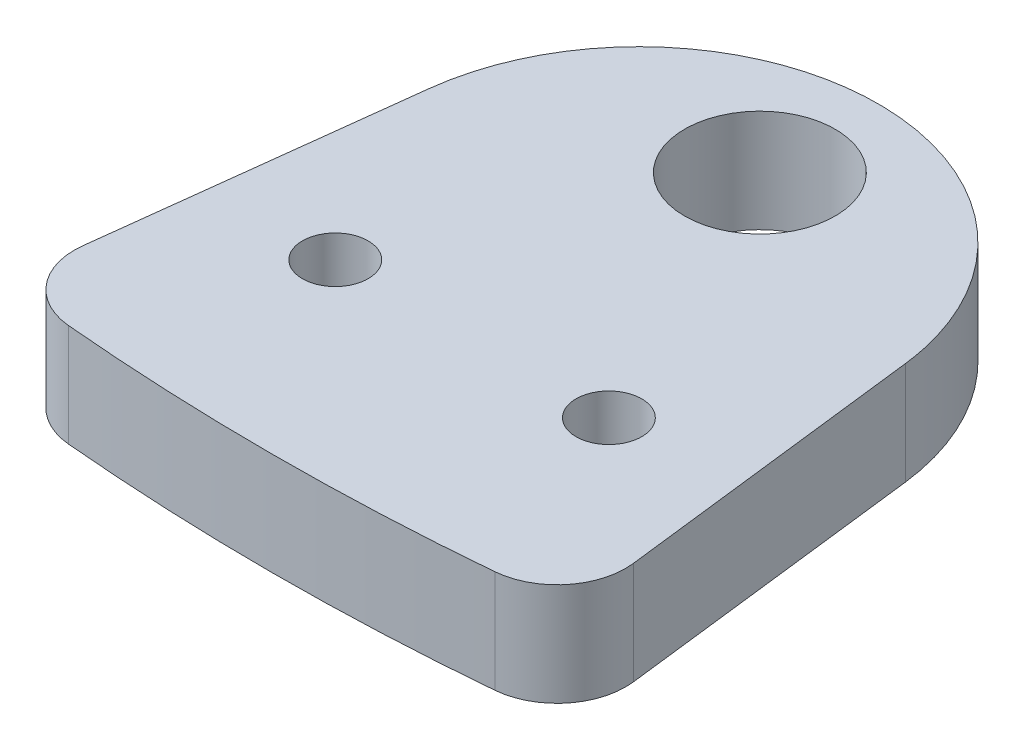
ISO-10303-21;
HEADER;
FILE_DESCRIPTION(('STEP AP214'),'2;1');
FILE_NAME('part.step','',(''),(''),'','','');
FILE_SCHEMA(('AUTOMOTIVE_DESIGN { 1 0 10303 214 1 1 1 1 }'));
ENDSEC;
DATA;
#1=APPLICATION_CONTEXT('core data for automotive mechanical design processes');
#2=APPLICATION_PROTOCOL_DEFINITION('international standard','automotive_design',2000,#1);
#3=PRODUCT_CONTEXT('',#1,'mechanical');
#4=PRODUCT('Part','Part','',(#3));
#5=PRODUCT_RELATED_PRODUCT_CATEGORY('part','',(#4));
#6=PRODUCT_DEFINITION_FORMATION('','',#4);
#7=PRODUCT_DEFINITION_CONTEXT('part definition',#1,'design');
#8=PRODUCT_DEFINITION('design','',#6,#7);
#9=PRODUCT_DEFINITION_SHAPE('','',#8);
#10=(LENGTH_UNIT() NAMED_UNIT(*) SI_UNIT(.MILLI.,.METRE.));
#11=(NAMED_UNIT(*) PLANE_ANGLE_UNIT() SI_UNIT($,.RADIAN.));
#12=(NAMED_UNIT(*) SI_UNIT($,.STERADIAN.) SOLID_ANGLE_UNIT());
#13=UNCERTAINTY_MEASURE_WITH_UNIT(LENGTH_MEASURE(1.E-05),#10,'distance_accuracy_value','');
#14=(GEOMETRIC_REPRESENTATION_CONTEXT(3) GLOBAL_UNCERTAINTY_ASSIGNED_CONTEXT((#13)) GLOBAL_UNIT_ASSIGNED_CONTEXT((#10,
#11,#12)) REPRESENTATION_CONTEXT('',''));
#15=CARTESIAN_POINT('',(0.,0.,0.));
#16=DIRECTION('',(0.,0.,1.));
#17=DIRECTION('',(1.,0.,0.));
#18=AXIS2_PLACEMENT_3D('',#15,#16,#17);
#19=CARTESIAN_POINT('',(-17.3953113975982,8.25,-14.5746056856521));
#20=CARTESIAN_POINT('',(-17.3953113975982,8.00000000000006,-14.5746056856521));
#21=CARTESIAN_POINT('',(-17.3953113975982,7.74999999999992,-14.5746056856521));
#22=CARTESIAN_POINT('',(-17.3953113975982,5.00000000000075,-14.5746056856521));
#23=CARTESIAN_POINT('',(-17.3953113975982,2.50000000000061,-14.5746056856521));
#24=CARTESIAN_POINT('',(-17.3953113975982,-0.250000000000061,-14.5746056856521));
#25=CARTESIAN_POINT('',(-17.3953113975982,-0.49999999999995,-14.5746056856521));
#26=CARTESIAN_POINT('',(-17.3953113975982,-0.750000000000001,-14.5746056856521));
#27=CARTESIAN_POINT('',(-14.0532399232116,8.25,-42.4816794773896));
#28=CARTESIAN_POINT('',(-14.0532399232116,8.00000000000006,-42.4816794773896));
#29=CARTESIAN_POINT('',(-14.0532399232116,7.74999999999993,-42.4816794773896));
#30=CARTESIAN_POINT('',(-14.0532399232116,5.00000000000075,-42.4816794773896));
#31=CARTESIAN_POINT('',(-14.0532399232116,2.50000000000061,-42.4816794773896));
#32=CARTESIAN_POINT('',(-14.0532399232116,-0.250000000000061,-42.4816794773896));
#33=CARTESIAN_POINT('',(-14.0532399232116,-0.499999999999949,-42.4816794773896));
#34=CARTESIAN_POINT('',(-14.0532399232116,-0.750000000000001,-42.4816794773896));
#35=CARTESIAN_POINT('',(14.0532399232116,8.25,-42.4816794773896));
#36=CARTESIAN_POINT('',(14.0532399232116,8.00000000000006,-42.4816794773896));
#37=CARTESIAN_POINT('',(14.0532399232116,7.74999999999993,-42.4816794773896));
#38=CARTESIAN_POINT('',(14.0532399232116,5.00000000000075,-42.4816794773896));
#39=CARTESIAN_POINT('',(14.0532399232116,2.50000000000061,-42.4816794773896));
#40=CARTESIAN_POINT('',(14.0532399232116,-0.250000000000061,-42.4816794773896));
#41=CARTESIAN_POINT('',(14.0532399232116,-0.499999999999948,-42.4816794773896));
#42=CARTESIAN_POINT('',(14.0532399232116,-0.750000000000001,-42.4816794773896));
#43=CARTESIAN_POINT('',(17.3953113975982,8.25,-14.5746056856521));
#44=CARTESIAN_POINT('',(17.3953113975982,8.00000000000006,-14.5746056856521));
#45=CARTESIAN_POINT('',(17.3953113975982,7.74999999999992,-14.5746056856521));
#46=CARTESIAN_POINT('',(17.3953113975982,5.00000000000075,-14.5746056856521));
#47=CARTESIAN_POINT('',(17.3953113975982,2.50000000000061,-14.5746056856521));
#48=CARTESIAN_POINT('',(17.3953113975982,-0.250000000000061,-14.5746056856521));
#49=CARTESIAN_POINT('',(17.3953113975982,-0.499999999999948,-14.5746056856521));
#50=CARTESIAN_POINT('',(17.3953113975982,-0.750000000000001,-14.5746056856521));
#51=(BOUNDED_SURFACE() B_SPLINE_SURFACE(3,3,((#19,#20,#21,#22,#23,#24,#25,#26),(#27,#28,#29,#30,
#31,#32,#33,#34),(#35,#36,#37,#38,#39,#40,#41,#42),(#43,#44,#45,#46,#47,#48,#49,#50)),
.UNSPECIFIED.,.F.,.F.,.F.) B_SPLINE_SURFACE_WITH_KNOTS((4,4),(4,2,2,4),(0.,1.),(-0.1,0.,1.,1.1),
.UNSPECIFIED.) GEOMETRIC_REPRESENTATION_ITEM() RATIONAL_B_SPLINE_SURFACE(((1.,1.,1.,1.,1.,1.,1.,
1.),(0.41260500526683,0.41260500526683,0.41260500526683,0.41260500526683,0.41260500526683,
0.41260500526683,0.41260500526683,0.41260500526683),(0.41260500526683,0.41260500526683,
0.41260500526683,0.41260500526683,0.41260500526683,0.41260500526683,0.41260500526683,
0.41260500526683),(1.,1.,1.,1.,1.,1.,1.,1.))) REPRESENTATION_ITEM('') SURFACE());
#52=CARTESIAN_POINT('',(17.3953113975982,8.25,-14.5746056856521));
#53=CARTESIAN_POINT('',(17.3953113975982,8.00000000000006,-14.5746056856521));
#54=CARTESIAN_POINT('',(17.3953113975982,7.74999999999992,-14.5746056856521));
#55=CARTESIAN_POINT('',(17.3953113975982,5.00000000000075,-14.5746056856521));
#56=CARTESIAN_POINT('',(17.3953113975982,2.50000000000061,-14.5746056856521));
#57=CARTESIAN_POINT('',(17.3953113975982,-0.250000000000061,-14.5746056856521));
#58=CARTESIAN_POINT('',(17.3953113975982,-0.499999999999948,-14.5746056856521));
#59=CARTESIAN_POINT('',(17.3953113975982,-0.750000000000001,-14.5746056856521));
#60=(BOUNDED_CURVE() B_SPLINE_CURVE(3,(#52,#53,#54,#55,#56,#57,#58,#59),.UNSPECIFIED.,.F.,
.F.) B_SPLINE_CURVE_WITH_KNOTS((4,2,2,4),(-0.1,0.,1.,1.1),
.UNSPECIFIED.) CURVE() GEOMETRIC_REPRESENTATION_ITEM() RATIONAL_B_SPLINE_CURVE((1.,1.,1.,1.,1.,
1.,1.,1.)) REPRESENTATION_ITEM(''));
#61=CARTESIAN_POINT('',(17.3953113975982,0.,-14.5746056856521));
#62=VERTEX_POINT('',#61);
#63=CARTESIAN_POINT('',(17.3953113975982,7.5,-14.5746056856521));
#64=VERTEX_POINT('',#63);
#65=EDGE_CURVE('E99',#62,#64,#60,.F.);
#66=CARTESIAN_POINT('',(17.3953113975982,0.,-14.5746056856521));
#67=CARTESIAN_POINT('',(14.0532399232116,0.,-42.4816794773896));
#68=CARTESIAN_POINT('',(-14.0532399232116,0.,-42.4816794773896));
#69=CARTESIAN_POINT('',(-17.3953113975982,0.,-14.5746056856521));
#70=(BOUNDED_CURVE() B_SPLINE_CURVE(3,(#66,#67,#68,#69),.UNSPECIFIED.,.F.,
.F.) B_SPLINE_CURVE_WITH_KNOTS((4,4),(0.,1.),
.UNSPECIFIED.) CURVE() GEOMETRIC_REPRESENTATION_ITEM() RATIONAL_B_SPLINE_CURVE((1.,
0.41260500526683,0.41260500526683,1.)) REPRESENTATION_ITEM(''));
#71=CARTESIAN_POINT('',(-17.3953113975982,0.,-14.5746056856521));
#72=VERTEX_POINT('',#71);
#73=EDGE_CURVE('E108',#72,#62,#70,.F.);
#74=CARTESIAN_POINT('',(-17.3953113975982,-0.750000000000001,-14.5746056856521));
#75=CARTESIAN_POINT('',(-17.3953113975982,-0.49999999999995,-14.5746056856521));
#76=CARTESIAN_POINT('',(-17.3953113975982,-0.250000000000061,-14.5746056856521));
#77=CARTESIAN_POINT('',(-17.3953113975982,2.50000000000061,-14.5746056856521));
#78=CARTESIAN_POINT('',(-17.3953113975982,5.00000000000075,-14.5746056856521));
#79=CARTESIAN_POINT('',(-17.3953113975982,7.74999999999992,-14.5746056856521));
#80=CARTESIAN_POINT('',(-17.3953113975982,8.00000000000006,-14.5746056856521));
#81=CARTESIAN_POINT('',(-17.3953113975982,8.25,-14.5746056856521));
#82=(BOUNDED_CURVE() B_SPLINE_CURVE(3,(#74,#75,#76,#77,#78,#79,#80,#81),.UNSPECIFIED.,.F.,
.F.) B_SPLINE_CURVE_WITH_KNOTS((4,2,2,4),(-0.1,0.,1.,1.1),
.UNSPECIFIED.) CURVE() GEOMETRIC_REPRESENTATION_ITEM() RATIONAL_B_SPLINE_CURVE((1.,1.,1.,1.,1.,
1.,1.,1.)) REPRESENTATION_ITEM(''));
#83=CARTESIAN_POINT('',(-17.3953113975982,7.5,-14.5746056856521));
#84=VERTEX_POINT('',#83);
#85=EDGE_CURVE('E118',#84,#72,#82,.F.);
#86=CARTESIAN_POINT('',(-17.3953113975982,7.5,-14.5746056856521));
#87=CARTESIAN_POINT('',(-14.0532399232116,7.5,-42.4816794773896));
#88=CARTESIAN_POINT('',(14.0532399232116,7.5,-42.4816794773896));
#89=CARTESIAN_POINT('',(17.3953113975982,7.5,-14.5746056856521));
#90=(BOUNDED_CURVE() B_SPLINE_CURVE(3,(#86,#87,#88,#89),.UNSPECIFIED.,.F.,
.F.) B_SPLINE_CURVE_WITH_KNOTS((4,4),(0.,1.),
.UNSPECIFIED.) CURVE() GEOMETRIC_REPRESENTATION_ITEM() RATIONAL_B_SPLINE_CURVE((1.,
0.41260500526683,0.41260500526683,1.)) REPRESENTATION_ITEM(''));
#91=EDGE_CURVE('E117',#64,#84,#90,.F.);
#92=ORIENTED_EDGE('',*,*,#65,.F.);
#93=ORIENTED_EDGE('',*,*,#73,.F.);
#94=ORIENTED_EDGE('',*,*,#85,.F.);
#95=ORIENTED_EDGE('',*,*,#91,.F.);
#96=EDGE_LOOP('',(#92,#93,#94,#95));
#97=FACE_BOUND('',#96,.T.);
#98=ADVANCED_FACE('F38',(#97),#51,.T.);
#99=CARTESIAN_POINT('',(0.,7.5,-159.8295));
#100=DIRECTION('',(0.,1.,0.));
#101=DIRECTION('',(0.,0.,1.));
#102=AXIS2_PLACEMENT_3D('',#99,#100,#101);
#103=PLANE('',#102);
#104=CARTESIAN_POINT('',(-9.99347696267863,7.5,-0.312731325210175));
#105=DIRECTION('',(0.,1.,0.));
#106=DIRECTION('',(0.,0.,1.));
#107=AXIS2_PLACEMENT_3D('',#104,#105,#106);
#108=CIRCLE('',#107,2.4);
#109=CARTESIAN_POINT('',(-9.99347696267863,7.5,2.08726867478982));
#110=VERTEX_POINT('',#109);
#111=EDGE_CURVE('E183',#110,#110,#108,.T.);
#112=ORIENTED_EDGE('',*,*,#111,.F.);
#113=EDGE_LOOP('',(#112));
#114=FACE_BOUND('',#113,.T.);
#115=CARTESIAN_POINT('',(9.99347696267863,7.5,-0.312731325210175));
#116=DIRECTION('',(0.,1.,0.));
#117=DIRECTION('',(0.,0.,1.));
#118=AXIS2_PLACEMENT_3D('',#115,#116,#117);
#119=CIRCLE('',#118,2.4);
#120=CARTESIAN_POINT('',(9.99347696267863,7.5,2.08726867478982));
#121=VERTEX_POINT('',#120);
#122=EDGE_CURVE('E182',#121,#121,#119,.T.);
#123=ORIENTED_EDGE('',*,*,#122,.F.);
#124=EDGE_LOOP('',(#123));
#125=FACE_BOUND('',#124,.T.);
#126=CARTESIAN_POINT('',(0.,7.5,-159.8295));
#127=DIRECTION('',(0.,1.,0.));
#128=DIRECTION('',(0.,0.,1.));
#129=AXIS2_PLACEMENT_3D('',#126,#127,#128);
#130=CIRCLE('',#129,174.117);
#131=CARTESIAN_POINT('',(-15.5834633324129,7.5,13.5887382552866));
#132=VERTEX_POINT('',#131);
#133=CARTESIAN_POINT('',(15.5834633324129,7.5,13.5887382552866));
#134=VERTEX_POINT('',#133);
#135=EDGE_CURVE('E226',#132,#134,#130,.T.);
#136=ORIENTED_EDGE('',*,*,#135,.T.);
#137=CARTESIAN_POINT('',(15.135963566956,7.5,8.6088041232005));
#138=DIRECTION('',(0.,1.,0.));
#139=DIRECTION('',(0.,0.,1.));
#140=AXIS2_PLACEMENT_3D('',#137,#138,#139);
#141=CIRCLE('',#140,5.);
#142=CARTESIAN_POINT('',(20.1004902426949,7.5,8.01426658369928));
#143=VERTEX_POINT('',#142);
#144=EDGE_CURVE('E46',#134,#143,#141,.T.);
#145=ORIENTED_EDGE('',*,*,#144,.T.);
#146=DIRECTION('',(-0.118907507900244,0.,-0.992905335147794));
#147=VECTOR('',#146,1.);
#148=CARTESIAN_POINT('',(17.3060365148173,7.5,-15.3200717119197));
#149=LINE('',#148,#147);
#150=EDGE_CURVE('E124',#143,#64,#149,.T.);
#151=ORIENTED_EDGE('',*,*,#150,.T.);
#152=ORIENTED_EDGE('',*,*,#91,.T.);
#153=DIRECTION('',(-0.118907507900245,0.,0.992905335147794));
#154=VECTOR('',#153,1.);
#155=CARTESIAN_POINT('',(-17.3060365148173,7.5,-15.3200717119197));
#156=LINE('',#155,#154);
#157=CARTESIAN_POINT('',(-20.1004902426949,7.5,8.01426658369927));
#158=VERTEX_POINT('',#157);
#159=EDGE_CURVE('E104',#84,#158,#156,.T.);
#160=ORIENTED_EDGE('',*,*,#159,.T.);
#161=CARTESIAN_POINT('',(-15.135963566956,7.5,8.6088041232005));
#162=DIRECTION('',(0.,1.,0.));
#163=DIRECTION('',(0.,0.,1.));
#164=AXIS2_PLACEMENT_3D('',#161,#162,#163);
#165=CIRCLE('',#164,5.);
#166=EDGE_CURVE('E219',#158,#132,#165,.T.);
#167=ORIENTED_EDGE('',*,*,#166,.T.);
#168=EDGE_LOOP('',(#136,#145,#151,#152,#160,#167));
#169=FACE_BOUND('',#168,.T.);
#170=CARTESIAN_POINT('',(0.,7.5,-21.336));
#171=DIRECTION('',(0.,1.,0.));
#172=DIRECTION('',(0.,0.,1.));
#173=AXIS2_PLACEMENT_3D('',#170,#171,#172);
#174=CIRCLE('',#173,5.5);
#175=CARTESIAN_POINT('',(0.,7.5,-15.836));
#176=VERTEX_POINT('',#175);
#177=EDGE_CURVE('E240',#176,#176,#174,.T.);
#178=ORIENTED_EDGE('',*,*,#177,.F.);
#179=EDGE_LOOP('',(#178));
#180=FACE_BOUND('',#179,.T.);
#181=ADVANCED_FACE('F148',(#114,#125,#169,#180),#103,.T.);
#182=CARTESIAN_POINT('',(0.,0.,-159.8295));
#183=DIRECTION('',(0.,1.,0.));
#184=DIRECTION('',(0.,0.,1.));
#185=AXIS2_PLACEMENT_3D('',#182,#183,#184);
#186=PLANE('',#185);
#187=CARTESIAN_POINT('',(-9.99347696267863,0.,-0.312731325210175));
#188=DIRECTION('',(0.,1.,0.));
#189=DIRECTION('',(0.,0.,1.));
#190=AXIS2_PLACEMENT_3D('',#187,#188,#189);
#191=CIRCLE('',#190,2.4);
#192=CARTESIAN_POINT('',(-9.99347696267863,0.,2.08726867478982));
#193=VERTEX_POINT('',#192);
#194=EDGE_CURVE('E175',#193,#193,#191,.T.);
#195=ORIENTED_EDGE('',*,*,#194,.T.);
#196=EDGE_LOOP('',(#195));
#197=FACE_BOUND('',#196,.T.);
#198=CARTESIAN_POINT('',(9.99347696267863,0.,-0.312731325210175));
#199=DIRECTION('',(0.,1.,0.));
#200=DIRECTION('',(0.,0.,1.));
#201=AXIS2_PLACEMENT_3D('',#198,#199,#200);
#202=CIRCLE('',#201,2.4);
#203=CARTESIAN_POINT('',(9.99347696267863,0.,2.08726867478982));
#204=VERTEX_POINT('',#203);
#205=EDGE_CURVE('E241',#204,#204,#202,.T.);
#206=ORIENTED_EDGE('',*,*,#205,.T.);
#207=EDGE_LOOP('',(#206));
#208=FACE_BOUND('',#207,.T.);
#209=DIRECTION('',(-0.118907507900245,0.,-0.992905335147794));
#210=VECTOR('',#209,1.);
#211=CARTESIAN_POINT('',(15.4363943143478,0.,-30.9320187491161));
#212=LINE('',#211,#210);
#213=CARTESIAN_POINT('',(20.1004902426949,0.,8.01426658369927));
#214=VERTEX_POINT('',#213);
#215=EDGE_CURVE('E94',#214,#62,#212,.T.);
#216=ORIENTED_EDGE('',*,*,#215,.F.);
#217=CARTESIAN_POINT('',(15.135963566956,0.,8.6088041232005));
#218=DIRECTION('',(0.,1.,0.));
#219=DIRECTION('',(0.,0.,1.));
#220=AXIS2_PLACEMENT_3D('',#217,#218,#219);
#221=CIRCLE('',#220,5.);
#222=CARTESIAN_POINT('',(15.5834633324129,0.,13.5887382552866));
#223=VERTEX_POINT('',#222);
#224=EDGE_CURVE('E218',#214,#223,#221,.F.);
#225=ORIENTED_EDGE('',*,*,#224,.T.);
#226=CARTESIAN_POINT('',(0.,0.,-159.8295));
#227=DIRECTION('',(0.,1.,0.));
#228=DIRECTION('',(0.,0.,1.));
#229=AXIS2_PLACEMENT_3D('',#226,#227,#228);
#230=CIRCLE('',#229,174.117);
#231=CARTESIAN_POINT('',(-15.5834633324129,0.,13.5887382552866));
#232=VERTEX_POINT('',#231);
#233=EDGE_CURVE('E105',#232,#223,#230,.T.);
#234=ORIENTED_EDGE('',*,*,#233,.F.);
#235=CARTESIAN_POINT('',(-15.135963566956,0.,8.6088041232005));
#236=DIRECTION('',(0.,1.,0.));
#237=DIRECTION('',(0.,0.,1.));
#238=AXIS2_PLACEMENT_3D('',#235,#236,#237);
#239=CIRCLE('',#238,5.);
#240=CARTESIAN_POINT('',(-20.1004902426949,0.,8.01426658369929));
#241=VERTEX_POINT('',#240);
#242=EDGE_CURVE('E227',#232,#241,#239,.F.);
#243=ORIENTED_EDGE('',*,*,#242,.T.);
#244=DIRECTION('',(-0.118907507900244,0.,0.992905335147794));
#245=VECTOR('',#244,1.);
#246=CARTESIAN_POINT('',(-17.3060365148173,0.,-15.3200717119197));
#247=LINE('',#246,#245);
#248=EDGE_CURVE('E112',#72,#241,#247,.T.);
#249=ORIENTED_EDGE('',*,*,#248,.F.);
#250=ORIENTED_EDGE('',*,*,#73,.T.);
#251=EDGE_LOOP('',(#216,#225,#234,#243,#249,#250));
#252=FACE_BOUND('',#251,.T.);
#253=CARTESIAN_POINT('',(0.,0.,-21.336));
#254=DIRECTION('',(0.,1.,0.));
#255=DIRECTION('',(0.,0.,1.));
#256=AXIS2_PLACEMENT_3D('',#253,#254,#255);
#257=CIRCLE('',#256,5.5);
#258=CARTESIAN_POINT('',(0.,0.,-15.836));
#259=VERTEX_POINT('',#258);
#260=EDGE_CURVE('E235',#259,#259,#257,.T.);
#261=ORIENTED_EDGE('',*,*,#260,.T.);
#262=EDGE_LOOP('',(#261));
#263=FACE_BOUND('',#262,.T.);
#264=ADVANCED_FACE('F110',(#197,#208,#252,#263),#186,.F.);
#265=CARTESIAN_POINT('',(-17.3060365148173,7.5,-15.3200717119197));
#266=DIRECTION('',(0.992905335147794,0.,0.118907507900244));
#267=DIRECTION('',(0.118907507900244,0.,-0.992905335147794));
#268=AXIS2_PLACEMENT_3D('',#265,#266,#267);
#269=PLANE('',#268);
#270=ORIENTED_EDGE('',*,*,#248,.T.);
#271=DIRECTION('',(0.,-1.,0.));
#272=VECTOR('',#271,1.);
#273=CARTESIAN_POINT('',(-20.1004902426949,7.5,8.01426658369929));
#274=LINE('',#273,#272);
#275=EDGE_CURVE('E12',#241,#158,#274,.F.);
#276=ORIENTED_EDGE('',*,*,#275,.T.);
#277=ORIENTED_EDGE('',*,*,#159,.F.);
#278=ORIENTED_EDGE('',*,*,#85,.T.);
#279=EDGE_LOOP('',(#270,#276,#277,#278));
#280=FACE_BOUND('',#279,.T.);
#281=ADVANCED_FACE('F149',(#280),#269,.F.);
#282=CARTESIAN_POINT('',(0.,7.5,-159.8295));
#283=DIRECTION('',(0.,-1.,0.));
#284=DIRECTION('',(0.,0.,-1.));
#285=AXIS2_PLACEMENT_3D('',#282,#283,#284);
#286=CYLINDRICAL_SURFACE('',#285,174.117);
#287=ORIENTED_EDGE('',*,*,#233,.T.);
#288=DIRECTION('',(0.,-1.,0.));
#289=VECTOR('',#288,1.);
#290=CARTESIAN_POINT('',(15.5834633324129,7.5,13.5887382552866));
#291=LINE('',#290,#289);
#292=EDGE_CURVE('E59',#223,#134,#291,.F.);
#293=ORIENTED_EDGE('',*,*,#292,.T.);
#294=ORIENTED_EDGE('',*,*,#135,.F.);
#295=DIRECTION('',(0.,-1.,0.));
#296=VECTOR('',#295,1.);
#297=CARTESIAN_POINT('',(-15.5834633324129,7.5,13.5887382552866));
#298=LINE('',#297,#296);
#299=EDGE_CURVE('E215',#132,#232,#298,.T.);
#300=ORIENTED_EDGE('',*,*,#299,.T.);
#301=EDGE_LOOP('',(#287,#293,#294,#300));
#302=FACE_BOUND('',#301,.T.);
#303=ADVANCED_FACE('F206',(#302),#286,.T.);
#304=CARTESIAN_POINT('',(15.4363943143478,7.5,-30.9320187491161));
#305=DIRECTION('',(-0.992905335147794,0.,0.118907507900245));
#306=DIRECTION('',(0.118907507900245,0.,0.992905335147794));
#307=AXIS2_PLACEMENT_3D('',#304,#305,#306);
#308=PLANE('',#307);
#309=ORIENTED_EDGE('',*,*,#150,.F.);
#310=DIRECTION('',(0.,-1.,0.));
#311=VECTOR('',#310,1.);
#312=CARTESIAN_POINT('',(20.1004902426949,7.5,8.01426658369927));
#313=LINE('',#312,#311);
#314=EDGE_CURVE('E102',#143,#214,#313,.T.);
#315=ORIENTED_EDGE('',*,*,#314,.T.);
#316=ORIENTED_EDGE('',*,*,#215,.T.);
#317=ORIENTED_EDGE('',*,*,#65,.T.);
#318=EDGE_LOOP('',(#309,#315,#316,#317));
#319=FACE_BOUND('',#318,.T.);
#320=ADVANCED_FACE('F97',(#319),#308,.F.);
#321=CARTESIAN_POINT('',(0.,7.5,-21.336));
#322=DIRECTION('',(0.,-1.,0.));
#323=DIRECTION('',(0.,0.,-1.));
#324=AXIS2_PLACEMENT_3D('',#321,#322,#323);
#325=CYLINDRICAL_SURFACE('',#324,5.5);
#326=ORIENTED_EDGE('',*,*,#177,.T.);
#327=EDGE_LOOP('',(#326));
#328=FACE_BOUND('',#327,.T.);
#329=ORIENTED_EDGE('',*,*,#260,.F.);
#330=EDGE_LOOP('',(#329));
#331=FACE_BOUND('',#330,.T.);
#332=ADVANCED_FACE('F205',(#328,#331),#325,.F.);
#333=CARTESIAN_POINT('',(9.99347696267863,7.5,-0.312731325210175));
#334=DIRECTION('',(0.,1.,0.));
#335=DIRECTION('',(0.,0.,1.));
#336=AXIS2_PLACEMENT_3D('',#333,#334,#335);
#337=CYLINDRICAL_SURFACE('',#336,2.4);
#338=ORIENTED_EDGE('',*,*,#122,.T.);
#339=EDGE_LOOP('',(#338));
#340=FACE_BOUND('',#339,.T.);
#341=ORIENTED_EDGE('',*,*,#205,.F.);
#342=EDGE_LOOP('',(#341));
#343=FACE_BOUND('',#342,.T.);
#344=ADVANCED_FACE('F258',(#340,#343),#337,.F.);
#345=CARTESIAN_POINT('',(-9.99347696267863,7.5,-0.312731325210175));
#346=DIRECTION('',(0.,1.,0.));
#347=DIRECTION('',(0.,0.,1.));
#348=AXIS2_PLACEMENT_3D('',#345,#346,#347);
#349=CYLINDRICAL_SURFACE('',#348,2.4);
#350=ORIENTED_EDGE('',*,*,#111,.T.);
#351=EDGE_LOOP('',(#350));
#352=FACE_BOUND('',#351,.T.);
#353=ORIENTED_EDGE('',*,*,#194,.F.);
#354=EDGE_LOOP('',(#353));
#355=FACE_BOUND('',#354,.T.);
#356=ADVANCED_FACE('F251',(#352,#355),#349,.F.);
#357=CARTESIAN_POINT('',(15.135963566956,7.5,8.6088041232005));
#358=DIRECTION('',(0.,-1.,0.));
#359=DIRECTION('',(0.,0.,-1.));
#360=AXIS2_PLACEMENT_3D('',#357,#358,#359);
#361=CYLINDRICAL_SURFACE('',#360,5.);
#362=ORIENTED_EDGE('',*,*,#144,.F.);
#363=ORIENTED_EDGE('',*,*,#292,.F.);
#364=ORIENTED_EDGE('',*,*,#224,.F.);
#365=ORIENTED_EDGE('',*,*,#314,.F.);
#366=EDGE_LOOP('',(#362,#363,#364,#365));
#367=FACE_BOUND('',#366,.T.);
#368=ADVANCED_FACE('F152',(#367),#361,.T.);
#369=CARTESIAN_POINT('',(-15.135963566956,7.5,8.6088041232005));
#370=DIRECTION('',(0.,-1.,0.));
#371=DIRECTION('',(0.,0.,-1.));
#372=AXIS2_PLACEMENT_3D('',#369,#370,#371);
#373=CYLINDRICAL_SURFACE('',#372,5.);
#374=ORIENTED_EDGE('',*,*,#166,.F.);
#375=ORIENTED_EDGE('',*,*,#275,.F.);
#376=ORIENTED_EDGE('',*,*,#242,.F.);
#377=ORIENTED_EDGE('',*,*,#299,.F.);
#378=EDGE_LOOP('',(#374,#375,#376,#377));
#379=FACE_BOUND('',#378,.T.);
#380=ADVANCED_FACE('F40',(#379),#373,.T.);
#381=CLOSED_SHELL('',(#98,#181,#264,#281,#303,#320,#332,#344,#356,#368,#380));
#382=MANIFOLD_SOLID_BREP('B2',#381);
#383=ADVANCED_BREP_SHAPE_REPRESENTATION('',(#18,#382),#14);
#384=SHAPE_DEFINITION_REPRESENTATION(#9,#383);
ENDSEC;
END-ISO-10303-21;
